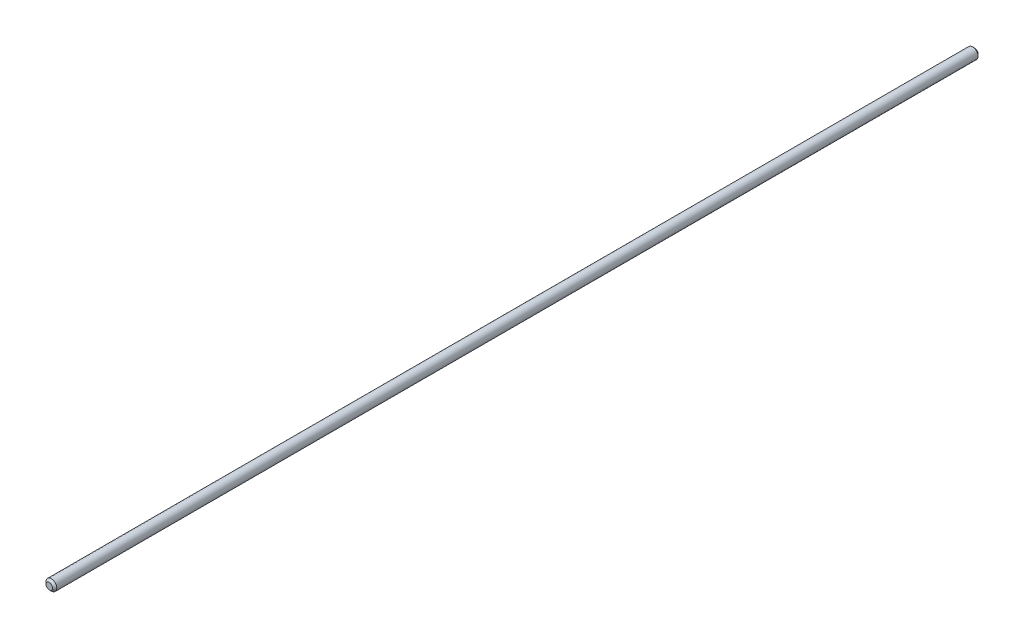
ISO-10303-21;
HEADER;
FILE_DESCRIPTION(('STEP AP214'),'2;1');
FILE_NAME('part.step','',(''),(''),'','','');
FILE_SCHEMA(('AUTOMOTIVE_DESIGN { 1 0 10303 214 1 1 1 1 }'));
ENDSEC;
DATA;
#1=APPLICATION_CONTEXT('core data for automotive mechanical design processes');
#2=APPLICATION_PROTOCOL_DEFINITION('international standard','automotive_design',2000,#1);
#3=PRODUCT_CONTEXT('',#1,'mechanical');
#4=PRODUCT('Part','Part','',(#3));
#5=PRODUCT_RELATED_PRODUCT_CATEGORY('part','',(#4));
#6=PRODUCT_DEFINITION_FORMATION('','',#4);
#7=PRODUCT_DEFINITION_CONTEXT('part definition',#1,'design');
#8=PRODUCT_DEFINITION('design','',#6,#7);
#9=PRODUCT_DEFINITION_SHAPE('','',#8);
#10=(LENGTH_UNIT() NAMED_UNIT(*) SI_UNIT(.MILLI.,.METRE.));
#11=(NAMED_UNIT(*) PLANE_ANGLE_UNIT() SI_UNIT($,.RADIAN.));
#12=(NAMED_UNIT(*) SI_UNIT($,.STERADIAN.) SOLID_ANGLE_UNIT());
#13=UNCERTAINTY_MEASURE_WITH_UNIT(LENGTH_MEASURE(1.E-05),#10,'distance_accuracy_value','');
#14=(GEOMETRIC_REPRESENTATION_CONTEXT(3) GLOBAL_UNCERTAINTY_ASSIGNED_CONTEXT((#13)) GLOBAL_UNIT_ASSIGNED_CONTEXT((#10,
#11,#12)) REPRESENTATION_CONTEXT('',''));
#15=CARTESIAN_POINT('',(0.,0.,0.));
#16=DIRECTION('',(0.,0.,1.));
#17=DIRECTION('',(1.,0.,0.));
#18=AXIS2_PLACEMENT_3D('',#15,#16,#17);
#19=CARTESIAN_POINT('',(0.,0.,214.5));
#20=DIRECTION('',(0.,0.,-1.));
#21=DIRECTION('',(-1.,0.,0.));
#22=AXIS2_PLACEMENT_3D('',#19,#20,#21);
#23=CYLINDRICAL_SURFACE('',#22,2.5);
#24=CARTESIAN_POINT('',(0.,0.,-213.5));
#25=DIRECTION('',(0.,0.,1.));
#26=DIRECTION('',(1.,0.,0.));
#27=AXIS2_PLACEMENT_3D('',#24,#25,#26);
#28=CIRCLE('',#27,2.5);
#29=CARTESIAN_POINT('',(2.5,0.,-213.5));
#30=VERTEX_POINT('',#29);
#31=EDGE_CURVE('E42',#30,#30,#28,.T.);
#32=ORIENTED_EDGE('',*,*,#31,.T.);
#33=EDGE_LOOP('',(#32));
#34=FACE_BOUND('',#33,.T.);
#35=CARTESIAN_POINT('',(0.,0.,213.5));
#36=DIRECTION('',(0.,0.,1.));
#37=DIRECTION('',(1.,0.,0.));
#38=AXIS2_PLACEMENT_3D('',#35,#36,#37);
#39=CIRCLE('',#38,2.5);
#40=CARTESIAN_POINT('',(2.5,0.,213.5));
#41=VERTEX_POINT('',#40);
#42=EDGE_CURVE('E46',#41,#41,#39,.F.);
#43=ORIENTED_EDGE('',*,*,#42,.T.);
#44=EDGE_LOOP('',(#43));
#45=FACE_BOUND('',#44,.T.);
#46=ADVANCED_FACE('F31',(#34,#45),#23,.T.);
#47=CARTESIAN_POINT('',(0.,0.,214.5));
#48=DIRECTION('',(0.,0.,1.));
#49=DIRECTION('',(1.,0.,0.));
#50=AXIS2_PLACEMENT_3D('',#47,#48,#49);
#51=PLANE('',#50);
#52=CARTESIAN_POINT('',(0.,0.,214.5));
#53=DIRECTION('',(0.,0.,1.));
#54=DIRECTION('',(1.,0.,0.));
#55=AXIS2_PLACEMENT_3D('',#52,#53,#54);
#56=CIRCLE('',#55,1.5);
#57=CARTESIAN_POINT('',(1.5,0.,214.5));
#58=VERTEX_POINT('',#57);
#59=EDGE_CURVE('E10',#58,#58,#56,.T.);
#60=ORIENTED_EDGE('',*,*,#59,.T.);
#61=EDGE_LOOP('',(#60));
#62=FACE_BOUND('',#61,.T.);
#63=ADVANCED_FACE('F62',(#62),#51,.T.);
#64=CARTESIAN_POINT('',(0.,0.,-214.5));
#65=DIRECTION('',(0.,0.,1.));
#66=DIRECTION('',(1.,0.,0.));
#67=AXIS2_PLACEMENT_3D('',#64,#65,#66);
#68=PLANE('',#67);
#69=CARTESIAN_POINT('',(0.,0.,-214.5));
#70=DIRECTION('',(0.,0.,1.));
#71=DIRECTION('',(1.,0.,0.));
#72=AXIS2_PLACEMENT_3D('',#69,#70,#71);
#73=CIRCLE('',#72,1.5);
#74=CARTESIAN_POINT('',(1.5,0.,-214.5));
#75=VERTEX_POINT('',#74);
#76=EDGE_CURVE('E38',#75,#75,#73,.F.);
#77=ORIENTED_EDGE('',*,*,#76,.T.);
#78=EDGE_LOOP('',(#77));
#79=FACE_BOUND('',#78,.T.);
#80=ADVANCED_FACE('F59',(#79),#68,.F.);
#81=CARTESIAN_POINT('',(0.,0.,-213.5));
#82=DIRECTION('',(0.,0.,1.));
#83=DIRECTION('',(1.,0.,0.));
#84=AXIS2_PLACEMENT_3D('',#81,#82,#83);
#85=CONICAL_SURFACE('',#84,2.5,0.785398163397447);
#86=ORIENTED_EDGE('',*,*,#76,.F.);
#87=EDGE_LOOP('',(#86));
#88=FACE_BOUND('',#87,.T.);
#89=ORIENTED_EDGE('',*,*,#31,.F.);
#90=EDGE_LOOP('',(#89));
#91=FACE_BOUND('',#90,.T.);
#92=ADVANCED_FACE('F55',(#88,#91),#85,.T.);
#93=CARTESIAN_POINT('',(0.,0.,214.5));
#94=DIRECTION('',(0.,0.,-1.));
#95=DIRECTION('',(-1.,0.,0.));
#96=AXIS2_PLACEMENT_3D('',#93,#94,#95);
#97=CONICAL_SURFACE('',#96,1.5,0.785398163397447);
#98=ORIENTED_EDGE('',*,*,#42,.F.);
#99=EDGE_LOOP('',(#98));
#100=FACE_BOUND('',#99,.T.);
#101=ORIENTED_EDGE('',*,*,#59,.F.);
#102=EDGE_LOOP('',(#101));
#103=FACE_BOUND('',#102,.T.);
#104=ADVANCED_FACE('F33',(#100,#103),#97,.T.);
#105=CLOSED_SHELL('',(#46,#63,#80,#92,#104));
#106=MANIFOLD_SOLID_BREP('B2',#105);
#107=ADVANCED_BREP_SHAPE_REPRESENTATION('',(#18,#106),#14);
#108=SHAPE_DEFINITION_REPRESENTATION(#9,#107);
ENDSEC;
END-ISO-10303-21;
